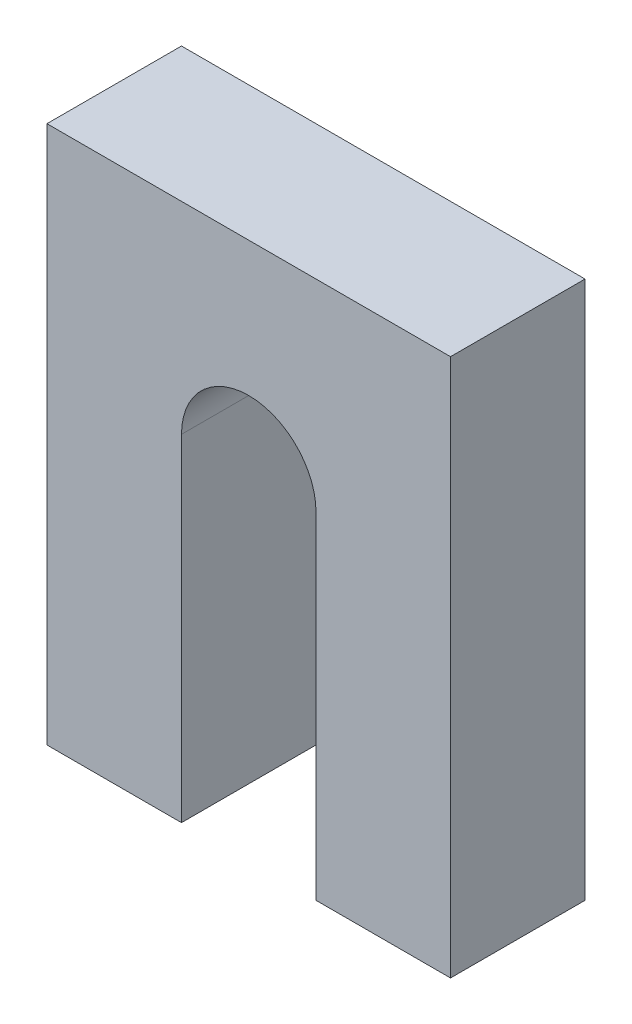
ISO-10303-21;
HEADER;
FILE_DESCRIPTION(('STEP AP214'),'2;1');
FILE_NAME('part.step','',(''),(''),'','','');
FILE_SCHEMA(('AUTOMOTIVE_DESIGN { 1 0 10303 214 1 1 1 1 }'));
ENDSEC;
DATA;
#1=APPLICATION_CONTEXT('core data for automotive mechanical design processes');
#2=APPLICATION_PROTOCOL_DEFINITION('international standard','automotive_design',2000,#1);
#3=PRODUCT_CONTEXT('',#1,'mechanical');
#4=PRODUCT('Part','Part','',(#3));
#5=PRODUCT_RELATED_PRODUCT_CATEGORY('part','',(#4));
#6=PRODUCT_DEFINITION_FORMATION('','',#4);
#7=PRODUCT_DEFINITION_CONTEXT('part definition',#1,'design');
#8=PRODUCT_DEFINITION('design','',#6,#7);
#9=PRODUCT_DEFINITION_SHAPE('','',#8);
#10=(LENGTH_UNIT() NAMED_UNIT(*) SI_UNIT(.MILLI.,.METRE.));
#11=(NAMED_UNIT(*) PLANE_ANGLE_UNIT() SI_UNIT($,.RADIAN.));
#12=(NAMED_UNIT(*) SI_UNIT($,.STERADIAN.) SOLID_ANGLE_UNIT());
#13=UNCERTAINTY_MEASURE_WITH_UNIT(LENGTH_MEASURE(1.E-05),#10,'distance_accuracy_value','');
#14=(GEOMETRIC_REPRESENTATION_CONTEXT(3) GLOBAL_UNCERTAINTY_ASSIGNED_CONTEXT((#13)) GLOBAL_UNIT_ASSIGNED_CONTEXT((#10,
#11,#12)) REPRESENTATION_CONTEXT('',''));
#15=CARTESIAN_POINT('',(0.,0.,0.));
#16=DIRECTION('',(0.,0.,1.));
#17=DIRECTION('',(1.,0.,0.));
#18=AXIS2_PLACEMENT_3D('',#15,#16,#17);
#19=CARTESIAN_POINT('',(15.,-25.,10.));
#20=DIRECTION('',(-1.,0.,0.));
#21=DIRECTION('',(0.,0.,1.));
#22=AXIS2_PLACEMENT_3D('',#19,#20,#21);
#23=PLANE('',#22);
#24=DIRECTION('',(0.,1.,0.));
#25=VECTOR('',#24,1.);
#26=CARTESIAN_POINT('',(15.,-25.,0.));
#27=LINE('',#26,#25);
#28=CARTESIAN_POINT('',(15.,-25.,0.));
#29=VERTEX_POINT('',#28);
#30=CARTESIAN_POINT('',(15.,15.,0.));
#31=VERTEX_POINT('',#30);
#32=EDGE_CURVE('E140',#29,#31,#27,.T.);
#33=ORIENTED_EDGE('',*,*,#32,.T.);
#34=DIRECTION('',(0.,0.,-1.));
#35=VECTOR('',#34,1.);
#36=CARTESIAN_POINT('',(15.,15.,10.));
#37=LINE('',#36,#35);
#38=CARTESIAN_POINT('',(15.,15.,10.));
#39=VERTEX_POINT('',#38);
#40=EDGE_CURVE('E11',#39,#31,#37,.T.);
#41=ORIENTED_EDGE('',*,*,#40,.F.);
#42=DIRECTION('',(0.,1.,0.));
#43=VECTOR('',#42,1.);
#44=CARTESIAN_POINT('',(15.,-25.,10.));
#45=LINE('',#44,#43);
#46=CARTESIAN_POINT('',(15.,-25.,10.));
#47=VERTEX_POINT('',#46);
#48=EDGE_CURVE('E162',#47,#39,#45,.T.);
#49=ORIENTED_EDGE('',*,*,#48,.F.);
#50=DIRECTION('',(0.,0.,-1.));
#51=VECTOR('',#50,1.);
#52=CARTESIAN_POINT('',(15.,-25.,10.));
#53=LINE('',#52,#51);
#54=EDGE_CURVE('E136',#47,#29,#53,.T.);
#55=ORIENTED_EDGE('',*,*,#54,.T.);
#56=EDGE_LOOP('',(#33,#41,#49,#55));
#57=FACE_BOUND('',#56,.T.);
#58=ADVANCED_FACE('F39',(#57),#23,.F.);
#59=CARTESIAN_POINT('',(-15.,15.,10.));
#60=DIRECTION('',(0.,-1.,0.));
#61=DIRECTION('',(0.,0.,-1.));
#62=AXIS2_PLACEMENT_3D('',#59,#60,#61);
#63=PLANE('',#62);
#64=DIRECTION('',(-1.,0.,0.));
#65=VECTOR('',#64,1.);
#66=CARTESIAN_POINT('',(-15.,15.,0.));
#67=LINE('',#66,#65);
#68=CARTESIAN_POINT('',(-15.,15.,0.));
#69=VERTEX_POINT('',#68);
#70=EDGE_CURVE('E144',#31,#69,#67,.T.);
#71=ORIENTED_EDGE('',*,*,#70,.T.);
#72=DIRECTION('',(0.,0.,-1.));
#73=VECTOR('',#72,1.);
#74=CARTESIAN_POINT('',(-15.,15.,10.));
#75=LINE('',#74,#73);
#76=CARTESIAN_POINT('',(-15.,15.,10.));
#77=VERTEX_POINT('',#76);
#78=EDGE_CURVE('E48',#77,#69,#75,.T.);
#79=ORIENTED_EDGE('',*,*,#78,.F.);
#80=DIRECTION('',(-1.,0.,0.));
#81=VECTOR('',#80,1.);
#82=CARTESIAN_POINT('',(-15.,15.,10.));
#83=LINE('',#82,#81);
#84=EDGE_CURVE('E99',#39,#77,#83,.T.);
#85=ORIENTED_EDGE('',*,*,#84,.F.);
#86=ORIENTED_EDGE('',*,*,#40,.T.);
#87=EDGE_LOOP('',(#71,#79,#85,#86));
#88=FACE_BOUND('',#87,.T.);
#89=ADVANCED_FACE('F208',(#88),#63,.F.);
#90=CARTESIAN_POINT('',(-15.,-25.,10.));
#91=DIRECTION('',(1.,0.,0.));
#92=DIRECTION('',(0.,0.,-1.));
#93=AXIS2_PLACEMENT_3D('',#90,#91,#92);
#94=PLANE('',#93);
#95=DIRECTION('',(0.,-1.,0.));
#96=VECTOR('',#95,1.);
#97=CARTESIAN_POINT('',(-15.,-25.,0.));
#98=LINE('',#97,#96);
#99=CARTESIAN_POINT('',(-15.,-25.,0.));
#100=VERTEX_POINT('',#99);
#101=EDGE_CURVE('E147',#69,#100,#98,.T.);
#102=ORIENTED_EDGE('',*,*,#101,.T.);
#103=DIRECTION('',(0.,0.,-1.));
#104=VECTOR('',#103,1.);
#105=CARTESIAN_POINT('',(-15.,-25.,10.));
#106=LINE('',#105,#104);
#107=CARTESIAN_POINT('',(-15.,-25.,10.));
#108=VERTEX_POINT('',#107);
#109=EDGE_CURVE('E173',#108,#100,#106,.T.);
#110=ORIENTED_EDGE('',*,*,#109,.F.);
#111=DIRECTION('',(0.,-1.,0.));
#112=VECTOR('',#111,1.);
#113=CARTESIAN_POINT('',(-15.,-25.,10.));
#114=LINE('',#113,#112);
#115=EDGE_CURVE('E183',#77,#108,#114,.T.);
#116=ORIENTED_EDGE('',*,*,#115,.F.);
#117=ORIENTED_EDGE('',*,*,#78,.T.);
#118=EDGE_LOOP('',(#102,#110,#116,#117));
#119=FACE_BOUND('',#118,.T.);
#120=ADVANCED_FACE('F181',(#119),#94,.F.);
#121=CARTESIAN_POINT('',(-5.,-25.,10.));
#122=DIRECTION('',(0.,1.,0.));
#123=DIRECTION('',(0.,0.,1.));
#124=AXIS2_PLACEMENT_3D('',#121,#122,#123);
#125=PLANE('',#124);
#126=DIRECTION('',(1.,0.,0.));
#127=VECTOR('',#126,1.);
#128=CARTESIAN_POINT('',(-5.,-25.,0.));
#129=LINE('',#128,#127);
#130=CARTESIAN_POINT('',(-5.,-25.,0.));
#131=VERTEX_POINT('',#130);
#132=EDGE_CURVE('E150',#100,#131,#129,.T.);
#133=ORIENTED_EDGE('',*,*,#132,.T.);
#134=DIRECTION('',(0.,0.,-1.));
#135=VECTOR('',#134,1.);
#136=CARTESIAN_POINT('',(-5.,-25.,10.));
#137=LINE('',#136,#135);
#138=CARTESIAN_POINT('',(-5.,-25.,10.));
#139=VERTEX_POINT('',#138);
#140=EDGE_CURVE('E169',#139,#131,#137,.T.);
#141=ORIENTED_EDGE('',*,*,#140,.F.);
#142=DIRECTION('',(1.,0.,0.));
#143=VECTOR('',#142,1.);
#144=CARTESIAN_POINT('',(-5.,-25.,10.));
#145=LINE('',#144,#143);
#146=EDGE_CURVE('E196',#108,#139,#145,.T.);
#147=ORIENTED_EDGE('',*,*,#146,.F.);
#148=ORIENTED_EDGE('',*,*,#109,.T.);
#149=EDGE_LOOP('',(#133,#141,#147,#148));
#150=FACE_BOUND('',#149,.T.);
#151=ADVANCED_FACE('F191',(#150),#125,.F.);
#152=CARTESIAN_POINT('',(-5.,0.,10.));
#153=DIRECTION('',(-1.,0.,0.));
#154=DIRECTION('',(0.,-1.,0.));
#155=AXIS2_PLACEMENT_3D('',#152,#153,#154);
#156=PLANE('',#155);
#157=DIRECTION('',(0.,1.,0.));
#158=VECTOR('',#157,1.);
#159=CARTESIAN_POINT('',(-5.,0.,0.));
#160=LINE('',#159,#158);
#161=CARTESIAN_POINT('',(-5.,0.,0.));
#162=VERTEX_POINT('',#161);
#163=EDGE_CURVE('E153',#131,#162,#160,.T.);
#164=ORIENTED_EDGE('',*,*,#163,.T.);
#165=DIRECTION('',(0.,0.,-1.));
#166=VECTOR('',#165,1.);
#167=CARTESIAN_POINT('',(-5.,0.,10.));
#168=LINE('',#167,#166);
#169=CARTESIAN_POINT('',(-5.,0.,10.));
#170=VERTEX_POINT('',#169);
#171=EDGE_CURVE('E129',#170,#162,#168,.T.);
#172=ORIENTED_EDGE('',*,*,#171,.F.);
#173=DIRECTION('',(0.,1.,0.));
#174=VECTOR('',#173,1.);
#175=CARTESIAN_POINT('',(-5.,0.,10.));
#176=LINE('',#175,#174);
#177=EDGE_CURVE('E118',#139,#170,#176,.T.);
#178=ORIENTED_EDGE('',*,*,#177,.F.);
#179=ORIENTED_EDGE('',*,*,#140,.T.);
#180=EDGE_LOOP('',(#164,#172,#178,#179));
#181=FACE_BOUND('',#180,.T.);
#182=ADVANCED_FACE('F194',(#181),#156,.F.);
#183=CARTESIAN_POINT('',(0.,0.,10.));
#184=DIRECTION('',(0.,0.,-1.));
#185=DIRECTION('',(-1.,0.,0.));
#186=AXIS2_PLACEMENT_3D('',#183,#184,#185);
#187=CYLINDRICAL_SURFACE('',#186,5.);
#188=CARTESIAN_POINT('',(0.,0.,0.));
#189=DIRECTION('',(0.,0.,-1.));
#190=DIRECTION('',(1.,0.,0.));
#191=AXIS2_PLACEMENT_3D('',#188,#189,#190);
#192=CIRCLE('',#191,5.);
#193=CARTESIAN_POINT('',(5.,0.,0.));
#194=VERTEX_POINT('',#193);
#195=EDGE_CURVE('E127',#162,#194,#192,.T.);
#196=ORIENTED_EDGE('',*,*,#195,.T.);
#197=DIRECTION('',(0.,0.,-1.));
#198=VECTOR('',#197,1.);
#199=CARTESIAN_POINT('',(5.,0.,10.));
#200=LINE('',#199,#198);
#201=CARTESIAN_POINT('',(5.,0.,10.));
#202=VERTEX_POINT('',#201);
#203=EDGE_CURVE('E124',#202,#194,#200,.T.);
#204=ORIENTED_EDGE('',*,*,#203,.F.);
#205=CARTESIAN_POINT('',(0.,0.,10.));
#206=DIRECTION('',(0.,0.,-1.));
#207=DIRECTION('',(1.,0.,0.));
#208=AXIS2_PLACEMENT_3D('',#205,#206,#207);
#209=CIRCLE('',#208,5.);
#210=EDGE_CURVE('E112',#170,#202,#209,.T.);
#211=ORIENTED_EDGE('',*,*,#210,.F.);
#212=ORIENTED_EDGE('',*,*,#171,.T.);
#213=EDGE_LOOP('',(#196,#204,#211,#212));
#214=FACE_BOUND('',#213,.T.);
#215=ADVANCED_FACE('F125',(#214),#187,.F.);
#216=CARTESIAN_POINT('',(5.,0.,10.));
#217=DIRECTION('',(1.,0.,0.));
#218=DIRECTION('',(0.,1.,0.));
#219=AXIS2_PLACEMENT_3D('',#216,#217,#218);
#220=PLANE('',#219);
#221=DIRECTION('',(0.,-1.,0.));
#222=VECTOR('',#221,1.);
#223=CARTESIAN_POINT('',(5.,0.,0.));
#224=LINE('',#223,#222);
#225=CARTESIAN_POINT('',(5.,-25.,0.));
#226=VERTEX_POINT('',#225);
#227=EDGE_CURVE('E85',#194,#226,#224,.T.);
#228=ORIENTED_EDGE('',*,*,#227,.T.);
#229=DIRECTION('',(0.,0.,-1.));
#230=VECTOR('',#229,1.);
#231=CARTESIAN_POINT('',(5.,-25.,10.));
#232=LINE('',#231,#230);
#233=CARTESIAN_POINT('',(5.,-25.,10.));
#234=VERTEX_POINT('',#233);
#235=EDGE_CURVE('E130',#234,#226,#232,.T.);
#236=ORIENTED_EDGE('',*,*,#235,.F.);
#237=DIRECTION('',(0.,-1.,0.));
#238=VECTOR('',#237,1.);
#239=CARTESIAN_POINT('',(5.,0.,10.));
#240=LINE('',#239,#238);
#241=EDGE_CURVE('E116',#202,#234,#240,.T.);
#242=ORIENTED_EDGE('',*,*,#241,.F.);
#243=ORIENTED_EDGE('',*,*,#203,.T.);
#244=EDGE_LOOP('',(#228,#236,#242,#243));
#245=FACE_BOUND('',#244,.T.);
#246=ADVANCED_FACE('F132',(#245),#220,.F.);
#247=CARTESIAN_POINT('',(5.,-25.,10.));
#248=DIRECTION('',(0.,1.,0.));
#249=DIRECTION('',(0.,0.,1.));
#250=AXIS2_PLACEMENT_3D('',#247,#248,#249);
#251=PLANE('',#250);
#252=DIRECTION('',(1.,0.,0.));
#253=VECTOR('',#252,1.);
#254=CARTESIAN_POINT('',(5.,-25.,0.));
#255=LINE('',#254,#253);
#256=EDGE_CURVE('E91',#226,#29,#255,.T.);
#257=ORIENTED_EDGE('',*,*,#256,.T.);
#258=ORIENTED_EDGE('',*,*,#54,.F.);
#259=DIRECTION('',(1.,0.,0.));
#260=VECTOR('',#259,1.);
#261=CARTESIAN_POINT('',(5.,-25.,10.));
#262=LINE('',#261,#260);
#263=EDGE_CURVE('E56',#234,#47,#262,.T.);
#264=ORIENTED_EDGE('',*,*,#263,.F.);
#265=ORIENTED_EDGE('',*,*,#235,.T.);
#266=EDGE_LOOP('',(#257,#258,#264,#265));
#267=FACE_BOUND('',#266,.T.);
#268=ADVANCED_FACE('F224',(#267),#251,.F.);
#269=CARTESIAN_POINT('',(0.,0.,10.));
#270=DIRECTION('',(0.,0.,1.));
#271=DIRECTION('',(1.,0.,0.));
#272=AXIS2_PLACEMENT_3D('',#269,#270,#271);
#273=PLANE('',#272);
#274=ORIENTED_EDGE('',*,*,#48,.T.);
#275=ORIENTED_EDGE('',*,*,#84,.T.);
#276=ORIENTED_EDGE('',*,*,#115,.T.);
#277=ORIENTED_EDGE('',*,*,#146,.T.);
#278=ORIENTED_EDGE('',*,*,#177,.T.);
#279=ORIENTED_EDGE('',*,*,#210,.T.);
#280=ORIENTED_EDGE('',*,*,#241,.T.);
#281=ORIENTED_EDGE('',*,*,#263,.T.);
#282=EDGE_LOOP('',(#274,#275,#276,#277,#278,#279,#280,#281));
#283=FACE_BOUND('',#282,.T.);
#284=ADVANCED_FACE('F114',(#283),#273,.T.);
#285=CARTESIAN_POINT('',(0.,0.,0.));
#286=DIRECTION('',(0.,0.,1.));
#287=DIRECTION('',(1.,0.,0.));
#288=AXIS2_PLACEMENT_3D('',#285,#286,#287);
#289=PLANE('',#288);
#290=ORIENTED_EDGE('',*,*,#32,.F.);
#291=ORIENTED_EDGE('',*,*,#256,.F.);
#292=ORIENTED_EDGE('',*,*,#227,.F.);
#293=ORIENTED_EDGE('',*,*,#195,.F.);
#294=ORIENTED_EDGE('',*,*,#163,.F.);
#295=ORIENTED_EDGE('',*,*,#132,.F.);
#296=ORIENTED_EDGE('',*,*,#101,.F.);
#297=ORIENTED_EDGE('',*,*,#70,.F.);
#298=EDGE_LOOP('',(#290,#291,#292,#293,#294,#295,#296,#297));
#299=FACE_BOUND('',#298,.T.);
#300=ADVANCED_FACE('F187',(#299),#289,.F.);
#301=CLOSED_SHELL('',(#58,#89,#120,#151,#182,#215,#246,#268,#284,#300));
#302=MANIFOLD_SOLID_BREP('B2',#301);
#303=ADVANCED_BREP_SHAPE_REPRESENTATION('',(#18,#302),#14);
#304=SHAPE_DEFINITION_REPRESENTATION(#9,#303);
ENDSEC;
END-ISO-10303-21;
